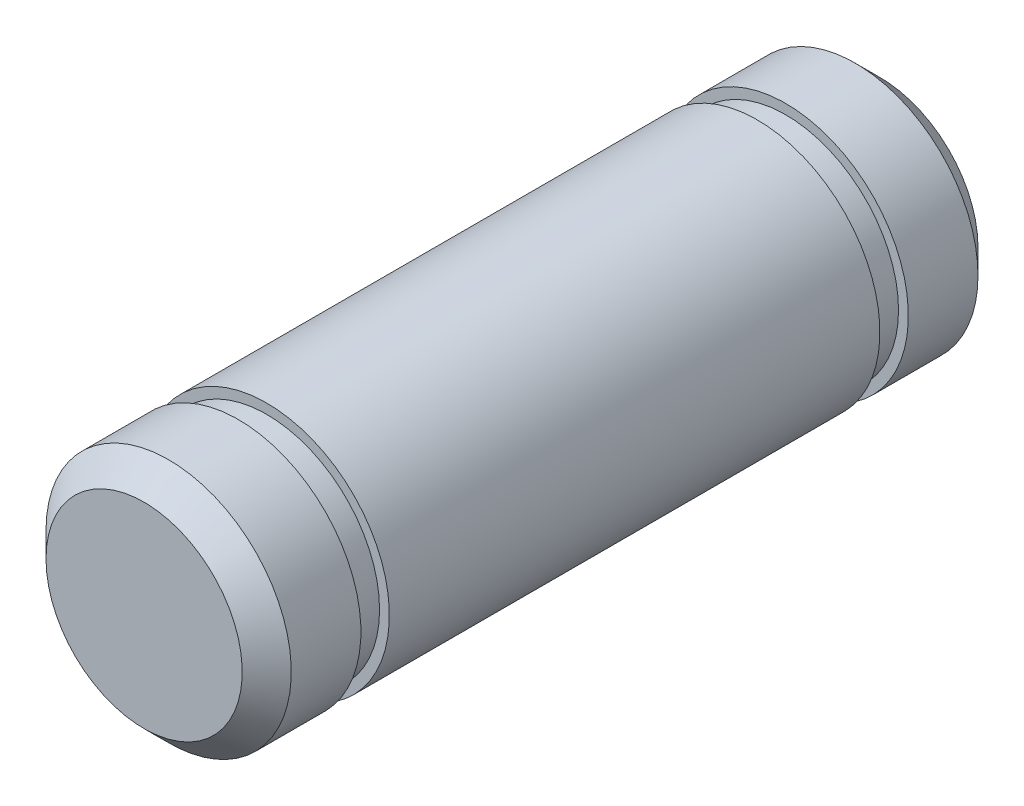
ISO-10303-21;
HEADER;
FILE_DESCRIPTION(('STEP AP214'),'2;1');
FILE_NAME('part.step','',(''),(''),'','','');
FILE_SCHEMA(('AUTOMOTIVE_DESIGN { 1 0 10303 214 1 1 1 1 }'));
ENDSEC;
DATA;
#1=APPLICATION_CONTEXT('core data for automotive mechanical design processes');
#2=APPLICATION_PROTOCOL_DEFINITION('international standard','automotive_design',2000,#1);
#3=PRODUCT_CONTEXT('',#1,'mechanical');
#4=PRODUCT('Part','Part','',(#3));
#5=PRODUCT_RELATED_PRODUCT_CATEGORY('part','',(#4));
#6=PRODUCT_DEFINITION_FORMATION('','',#4);
#7=PRODUCT_DEFINITION_CONTEXT('part definition',#1,'design');
#8=PRODUCT_DEFINITION('design','',#6,#7);
#9=PRODUCT_DEFINITION_SHAPE('','',#8);
#10=(LENGTH_UNIT() NAMED_UNIT(*) SI_UNIT(.MILLI.,.METRE.));
#11=(NAMED_UNIT(*) PLANE_ANGLE_UNIT() SI_UNIT($,.RADIAN.));
#12=(NAMED_UNIT(*) SI_UNIT($,.STERADIAN.) SOLID_ANGLE_UNIT());
#13=UNCERTAINTY_MEASURE_WITH_UNIT(LENGTH_MEASURE(1.E-05),#10,'distance_accuracy_value','');
#14=(GEOMETRIC_REPRESENTATION_CONTEXT(3) GLOBAL_UNCERTAINTY_ASSIGNED_CONTEXT((#13)) GLOBAL_UNIT_ASSIGNED_CONTEXT((#10,
#11,#12)) REPRESENTATION_CONTEXT('',''));
#15=CARTESIAN_POINT('',(0.,0.,0.));
#16=DIRECTION('',(0.,0.,1.));
#17=DIRECTION('',(1.,0.,0.));
#18=AXIS2_PLACEMENT_3D('',#15,#16,#17);
#19=CARTESIAN_POINT('',(0.,0.,76.2));
#20=DIRECTION('',(0.,0.,-1.));
#21=DIRECTION('',(-1.,0.,0.));
#22=AXIS2_PLACEMENT_3D('',#19,#20,#21);
#23=CYLINDRICAL_SURFACE('',#22,3.175);
#24=CARTESIAN_POINT('',(0.,0.,-59.5884));
#25=DIRECTION('',(0.,0.,1.));
#26=DIRECTION('',(1.,0.,0.));
#27=AXIS2_PLACEMENT_3D('',#24,#25,#26);
#28=CIRCLE('',#27,3.175);
#29=CARTESIAN_POINT('',(-3.175,0.,-59.5884));
#30=VERTEX_POINT('',#29);
#31=EDGE_CURVE('E56',#30,#30,#28,.T.);
#32=CARTESIAN_POINT('',(0.,0.,-57.785));
#33=DIRECTION('',(0.,0.,-1.));
#34=DIRECTION('',(-1.,0.,0.));
#35=AXIS2_PLACEMENT_3D('',#32,#33,#34);
#36=CIRCLE('',#35,3.175);
#37=CARTESIAN_POINT('',(-3.175,0.,-57.785));
#38=VERTEX_POINT('',#37);
#39=EDGE_CURVE('E43',#38,#38,#36,.T.);
#40=CARTESIAN_POINT('',(-3.175,0.,-59.5884));
#41=CARTESIAN_POINT('',(-3.175,0.,-59.5696145833333));
#42=CARTESIAN_POINT('',(-3.175,0.,-59.5508291666667));
#43=CARTESIAN_POINT('',(-3.175,0.,-59.5132583333333));
#44=CARTESIAN_POINT('',(-3.175,0.,-59.4944729166667));
#45=CARTESIAN_POINT('',(-3.175,0.,-59.4569020833333));
#46=CARTESIAN_POINT('',(-3.175,0.,-59.4381166666667));
#47=CARTESIAN_POINT('',(-3.175,0.,-59.4005458333333));
#48=CARTESIAN_POINT('',(-3.175,0.,-59.3817604166667));
#49=CARTESIAN_POINT('',(-3.175,0.,-59.3441895833333));
#50=CARTESIAN_POINT('',(-3.175,0.,-59.3254041666667));
#51=CARTESIAN_POINT('',(-3.175,0.,-59.2878333333333));
#52=CARTESIAN_POINT('',(-3.175,0.,-59.2690479166667));
#53=CARTESIAN_POINT('',(-3.175,0.,-59.2314770833333));
#54=CARTESIAN_POINT('',(-3.175,0.,-59.2126916666667));
#55=CARTESIAN_POINT('',(-3.175,0.,-59.1751208333333));
#56=CARTESIAN_POINT('',(-3.175,0.,-59.1563354166667));
#57=CARTESIAN_POINT('',(-3.175,0.,-59.1187645833333));
#58=CARTESIAN_POINT('',(-3.175,0.,-59.0999791666667));
#59=CARTESIAN_POINT('',(-3.175,0.,-59.0624083333333));
#60=CARTESIAN_POINT('',(-3.175,0.,-59.0436229166667));
#61=CARTESIAN_POINT('',(-3.175,0.,-59.0060520833333));
#62=CARTESIAN_POINT('',(-3.175,0.,-58.9872666666667));
#63=CARTESIAN_POINT('',(-3.175,0.,-58.9496958333333));
#64=CARTESIAN_POINT('',(-3.175,0.,-58.9309104166667));
#65=CARTESIAN_POINT('',(-3.175,0.,-58.8933395833333));
#66=CARTESIAN_POINT('',(-3.175,0.,-58.8745541666667));
#67=CARTESIAN_POINT('',(-3.175,0.,-58.8369833333333));
#68=CARTESIAN_POINT('',(-3.175,0.,-58.8181979166667));
#69=CARTESIAN_POINT('',(-3.175,0.,-58.7806270833333));
#70=CARTESIAN_POINT('',(-3.175,0.,-58.7618416666667));
#71=CARTESIAN_POINT('',(-3.175,0.,-58.7242708333333));
#72=CARTESIAN_POINT('',(-3.175,0.,-58.7054854166667));
#73=CARTESIAN_POINT('',(-3.175,0.,-58.6679145833333));
#74=CARTESIAN_POINT('',(-3.175,0.,-58.6491291666667));
#75=CARTESIAN_POINT('',(-3.175,0.,-58.6115583333333));
#76=CARTESIAN_POINT('',(-3.175,0.,-58.5927729166667));
#77=CARTESIAN_POINT('',(-3.175,0.,-58.5552020833333));
#78=CARTESIAN_POINT('',(-3.175,0.,-58.5364166666667));
#79=CARTESIAN_POINT('',(-3.175,0.,-58.4988458333333));
#80=CARTESIAN_POINT('',(-3.175,0.,-58.4800604166667));
#81=CARTESIAN_POINT('',(-3.175,0.,-58.4424895833333));
#82=CARTESIAN_POINT('',(-3.175,0.,-58.4237041666667));
#83=CARTESIAN_POINT('',(-3.175,0.,-58.3861333333333));
#84=CARTESIAN_POINT('',(-3.175,0.,-58.3673479166667));
#85=CARTESIAN_POINT('',(-3.175,0.,-58.3297770833333));
#86=CARTESIAN_POINT('',(-3.175,0.,-58.3109916666667));
#87=CARTESIAN_POINT('',(-3.175,0.,-58.2734208333333));
#88=CARTESIAN_POINT('',(-3.175,0.,-58.2546354166667));
#89=CARTESIAN_POINT('',(-3.175,0.,-58.2170645833333));
#90=CARTESIAN_POINT('',(-3.175,0.,-58.1982791666667));
#91=CARTESIAN_POINT('',(-3.175,0.,-58.1607083333333));
#92=CARTESIAN_POINT('',(-3.175,0.,-58.1419229166667));
#93=CARTESIAN_POINT('',(-3.175,0.,-58.1043520833333));
#94=CARTESIAN_POINT('',(-3.175,0.,-58.0855666666667));
#95=CARTESIAN_POINT('',(-3.175,0.,-58.0479958333333));
#96=CARTESIAN_POINT('',(-3.175,0.,-58.0292104166667));
#97=CARTESIAN_POINT('',(-3.175,0.,-57.9916395833333));
#98=CARTESIAN_POINT('',(-3.175,0.,-57.9728541666667));
#99=CARTESIAN_POINT('',(-3.175,0.,-57.9352833333333));
#100=CARTESIAN_POINT('',(-3.175,0.,-57.9164979166667));
#101=CARTESIAN_POINT('',(-3.175,0.,-57.8789270833333));
#102=CARTESIAN_POINT('',(-3.175,0.,-57.8601416666667));
#103=CARTESIAN_POINT('',(-3.175,0.,-57.8225708333333));
#104=CARTESIAN_POINT('',(-3.175,0.,-57.8037854166667));
#105=CARTESIAN_POINT('',(-3.175,0.,-57.785));
#106=B_SPLINE_CURVE_WITH_KNOTS('',3,(#40,#41,#42,#43,#44,#45,#46,#47,#48,#49,#50,#51,#52,#53,
#54,#55,#56,#57,#58,#59,#60,#61,#62,#63,#64,#65,#66,#67,#68,#69,#70,#71,#72,#73,#74,#75,#76,#77,
#78,#79,#80,#81,#82,#83,#84,#85,#86,#87,#88,#89,#90,#91,#92,#93,#94,#95,#96,#97,#98,#99,#100,
#101,#102,#103,#104,#105),.UNSPECIFIED.,.F.,.F.,(4,2,2,2,2,2,2,2,2,2,2,2,2,2,2,2,2,2,2,2,2,2,2,
2,2,2,2,2,2,2,2,2,4),(0.,0.0563562500000003,0.112712500000001,0.169068750000001,
0.225425000000001,0.281781250000002,0.338137500000002,0.394493750000002,0.450850000000003,
0.507206250000003,0.563562500000003,0.619918750000004,0.676275000000004,0.732631250000004,
0.788987500000005,0.845343750000005,0.901700000000005,0.958056250000006,1.01441250000001,
1.07076875000001,1.12712500000001,1.18348125000001,1.23983750000001,1.29619375000001,
1.35255000000001,1.40890625000001,1.46526250000001,1.52161875000001,1.57797500000001,
1.63433125000001,1.69068750000001,1.74704375000001,1.80340000000001),.UNSPECIFIED.);
#107=EDGE_CURVE('BSEAM35',#30,#38,#106,.T.);
#108=ORIENTED_EDGE('',*,*,#31,.T.);
#109=ORIENTED_EDGE('',*,*,#39,.T.);
#110=ORIENTED_EDGE('',*,*,#107,.T.);
#111=ORIENTED_EDGE('',*,*,#107,.F.);
#112=EDGE_LOOP('',(#108,#110,#109,#111));
#113=FACE_BOUND('',#112,.T.);
#114=ADVANCED_FACE('F35',(#113),#23,.T.);
#115=CARTESIAN_POINT('',(0.,0.,-57.15));
#116=DIRECTION('',(0.,0.,-1.));
#117=DIRECTION('',(-1.,0.,0.));
#118=AXIS2_PLACEMENT_3D('',#115,#116,#117);
#119=PLANE('',#118);
#120=CARTESIAN_POINT('',(0.,0.,-57.15));
#121=DIRECTION('',(0.,0.,-1.));
#122=DIRECTION('',(-1.,0.,0.));
#123=AXIS2_PLACEMENT_3D('',#120,#121,#122);
#124=CIRCLE('',#123,2.54);
#125=CARTESIAN_POINT('',(-2.54,0.,-57.15));
#126=VERTEX_POINT('',#125);
#127=EDGE_CURVE('E10',#126,#126,#124,.F.);
#128=ORIENTED_EDGE('',*,*,#127,.T.);
#129=EDGE_LOOP('',(#128));
#130=FACE_BOUND('',#129,.T.);
#131=ADVANCED_FACE('F124',(#130),#119,.F.);
#132=CARTESIAN_POINT('',(0.,0.,-57.785));
#133=DIRECTION('',(0.,0.,-1.));
#134=DIRECTION('',(-1.,0.,0.));
#135=AXIS2_PLACEMENT_3D('',#132,#133,#134);
#136=CONICAL_SURFACE('',#135,3.175,0.785398163397459);
#137=ORIENTED_EDGE('',*,*,#127,.F.);
#138=EDGE_LOOP('',(#137));
#139=FACE_BOUND('',#138,.T.);
#140=ORIENTED_EDGE('',*,*,#39,.F.);
#141=EDGE_LOOP('',(#140));
#142=FACE_BOUND('',#141,.T.);
#143=ADVANCED_FACE('F38',(#139,#142),#136,.T.);
#144=CARTESIAN_POINT('',(3.175,0.,-59.5884));
#145=DIRECTION('',(0.,0.,1.));
#146=DIRECTION('',(1.,0.,0.));
#147=AXIS2_PLACEMENT_3D('',#144,#145,#146);
#148=PLANE('',#147);
#149=ORIENTED_EDGE('',*,*,#31,.F.);
#150=EDGE_LOOP('',(#149));
#151=FACE_BOUND('',#150,.T.);
#152=CARTESIAN_POINT('',(0.,0.,-59.5884));
#153=DIRECTION('',(0.,0.,1.));
#154=DIRECTION('',(1.,0.,0.));
#155=AXIS2_PLACEMENT_3D('',#152,#153,#154);
#156=CIRCLE('',#155,2.921);
#157=CARTESIAN_POINT('',(2.921,0.,-59.5884));
#158=VERTEX_POINT('',#157);
#159=EDGE_CURVE('E72',#158,#158,#156,.T.);
#160=ORIENTED_EDGE('',*,*,#159,.T.);
#161=EDGE_LOOP('',(#160));
#162=FACE_BOUND('',#161,.T.);
#163=ADVANCED_FACE('F132',(#151,#162),#148,.F.);
#164=CARTESIAN_POINT('',(0.,0.,-57.785));
#165=DIRECTION('',(0.,0.,1.));
#166=DIRECTION('',(1.,0.,0.));
#167=AXIS2_PLACEMENT_3D('',#164,#165,#166);
#168=CYLINDRICAL_SURFACE('',#167,2.921);
#169=ORIENTED_EDGE('',*,*,#159,.F.);
#170=EDGE_LOOP('',(#169));
#171=FACE_BOUND('',#170,.T.);
#172=CARTESIAN_POINT('',(0.,0.,-60.325));
#173=DIRECTION('',(0.,0.,1.));
#174=DIRECTION('',(1.,0.,0.));
#175=AXIS2_PLACEMENT_3D('',#172,#173,#174);
#176=CIRCLE('',#175,2.921);
#177=CARTESIAN_POINT('',(2.921,0.,-60.325));
#178=VERTEX_POINT('',#177);
#179=EDGE_CURVE('E75',#178,#178,#176,.T.);
#180=ORIENTED_EDGE('',*,*,#179,.T.);
#181=EDGE_LOOP('',(#180));
#182=FACE_BOUND('',#181,.T.);
#183=ADVANCED_FACE('F135',(#171,#182),#168,.T.);
#184=CARTESIAN_POINT('',(3.175,0.,-60.325));
#185=DIRECTION('',(0.,0.,-1.));
#186=DIRECTION('',(-1.,0.,0.));
#187=AXIS2_PLACEMENT_3D('',#184,#185,#186);
#188=PLANE('',#187);
#189=ORIENTED_EDGE('',*,*,#179,.F.);
#190=EDGE_LOOP('',(#189));
#191=FACE_BOUND('',#190,.T.);
#192=CARTESIAN_POINT('',(0.,0.,-60.325));
#193=DIRECTION('',(0.,0.,1.));
#194=DIRECTION('',(1.,0.,0.));
#195=AXIS2_PLACEMENT_3D('',#192,#193,#194);
#196=CIRCLE('',#195,3.175);
#197=CARTESIAN_POINT('',(-3.175,0.,-60.325));
#198=VERTEX_POINT('',#197);
#199=EDGE_CURVE('E60',#198,#198,#196,.T.);
#200=ORIENTED_EDGE('',*,*,#199,.T.);
#201=EDGE_LOOP('',(#200));
#202=FACE_BOUND('',#201,.T.);
#203=ADVANCED_FACE('F81',(#191,#202),#188,.F.);
#204=CARTESIAN_POINT('',(0.,0.,-73.025));
#205=DIRECTION('',(0.,0.,1.));
#206=DIRECTION('',(1.,0.,0.));
#207=AXIS2_PLACEMENT_3D('',#204,#205,#206);
#208=CIRCLE('',#207,3.175);
#209=CARTESIAN_POINT('',(-3.175,0.,-73.025));
#210=VERTEX_POINT('',#209);
#211=EDGE_CURVE('E57',#210,#210,#208,.T.);
#212=CARTESIAN_POINT('',(-3.175,0.,-60.325));
#213=CARTESIAN_POINT('',(-3.175,0.,-60.4572916666667));
#214=CARTESIAN_POINT('',(-3.175,0.,-60.5895833333334));
#215=CARTESIAN_POINT('',(-3.175,0.,-60.8541666666667));
#216=CARTESIAN_POINT('',(-3.175,0.,-60.9864583333334));
#217=CARTESIAN_POINT('',(-3.175,0.,-61.2510416666667));
#218=CARTESIAN_POINT('',(-3.175,0.,-61.3833333333334));
#219=CARTESIAN_POINT('',(-3.175,0.,-61.6479166666667));
#220=CARTESIAN_POINT('',(-3.175,0.,-61.7802083333334));
#221=CARTESIAN_POINT('',(-3.175,0.,-62.0447916666667));
#222=CARTESIAN_POINT('',(-3.175,0.,-62.1770833333334));
#223=CARTESIAN_POINT('',(-3.175,0.,-62.4416666666667));
#224=CARTESIAN_POINT('',(-3.175,0.,-62.5739583333334));
#225=CARTESIAN_POINT('',(-3.175,0.,-62.8385416666667));
#226=CARTESIAN_POINT('',(-3.175,0.,-62.9708333333334));
#227=CARTESIAN_POINT('',(-3.175,0.,-63.2354166666667));
#228=CARTESIAN_POINT('',(-3.175,0.,-63.3677083333334));
#229=CARTESIAN_POINT('',(-3.175,0.,-63.6322916666667));
#230=CARTESIAN_POINT('',(-3.175,0.,-63.7645833333334));
#231=CARTESIAN_POINT('',(-3.175,0.,-64.0291666666667));
#232=CARTESIAN_POINT('',(-3.175,0.,-64.1614583333334));
#233=CARTESIAN_POINT('',(-3.175,0.,-64.4260416666667));
#234=CARTESIAN_POINT('',(-3.175,0.,-64.5583333333334));
#235=CARTESIAN_POINT('',(-3.175,0.,-64.8229166666667));
#236=CARTESIAN_POINT('',(-3.175,0.,-64.9552083333334));
#237=CARTESIAN_POINT('',(-3.175,0.,-65.2197916666667));
#238=CARTESIAN_POINT('',(-3.175,0.,-65.3520833333334));
#239=CARTESIAN_POINT('',(-3.175,0.,-65.6166666666667));
#240=CARTESIAN_POINT('',(-3.175,0.,-65.7489583333334));
#241=CARTESIAN_POINT('',(-3.175,0.,-66.0135416666667));
#242=CARTESIAN_POINT('',(-3.175,0.,-66.1458333333334));
#243=CARTESIAN_POINT('',(-3.175,0.,-66.4104166666667));
#244=CARTESIAN_POINT('',(-3.175,0.,-66.5427083333334));
#245=CARTESIAN_POINT('',(-3.175,0.,-66.8072916666667));
#246=CARTESIAN_POINT('',(-3.175,0.,-66.9395833333334));
#247=CARTESIAN_POINT('',(-3.175,0.,-67.2041666666667));
#248=CARTESIAN_POINT('',(-3.175,0.,-67.3364583333334));
#249=CARTESIAN_POINT('',(-3.175,0.,-67.6010416666667));
#250=CARTESIAN_POINT('',(-3.175,0.,-67.7333333333334));
#251=CARTESIAN_POINT('',(-3.175,0.,-67.9979166666667));
#252=CARTESIAN_POINT('',(-3.175,0.,-68.1302083333334));
#253=CARTESIAN_POINT('',(-3.175,0.,-68.3947916666667));
#254=CARTESIAN_POINT('',(-3.175,0.,-68.5270833333334));
#255=CARTESIAN_POINT('',(-3.175,0.,-68.7916666666667));
#256=CARTESIAN_POINT('',(-3.175,0.,-68.9239583333334));
#257=CARTESIAN_POINT('',(-3.175,0.,-69.1885416666667));
#258=CARTESIAN_POINT('',(-3.175,0.,-69.3208333333334));
#259=CARTESIAN_POINT('',(-3.175,0.,-69.5854166666667));
#260=CARTESIAN_POINT('',(-3.175,0.,-69.7177083333334));
#261=CARTESIAN_POINT('',(-3.175,0.,-69.9822916666667));
#262=CARTESIAN_POINT('',(-3.175,0.,-70.1145833333334));
#263=CARTESIAN_POINT('',(-3.175,0.,-70.3791666666667));
#264=CARTESIAN_POINT('',(-3.175,0.,-70.5114583333334));
#265=CARTESIAN_POINT('',(-3.175,0.,-70.7760416666667));
#266=CARTESIAN_POINT('',(-3.175,0.,-70.9083333333333));
#267=CARTESIAN_POINT('',(-3.175,0.,-71.1729166666667));
#268=CARTESIAN_POINT('',(-3.175,0.,-71.3052083333334));
#269=CARTESIAN_POINT('',(-3.175,0.,-71.5697916666667));
#270=CARTESIAN_POINT('',(-3.175,0.,-71.7020833333334));
#271=CARTESIAN_POINT('',(-3.175,0.,-71.9666666666667));
#272=CARTESIAN_POINT('',(-3.175,0.,-72.0989583333334));
#273=CARTESIAN_POINT('',(-3.175,0.,-72.3635416666667));
#274=CARTESIAN_POINT('',(-3.175,0.,-72.4958333333334));
#275=CARTESIAN_POINT('',(-3.175,0.,-72.7604166666667));
#276=CARTESIAN_POINT('',(-3.175,0.,-72.8927083333334));
#277=CARTESIAN_POINT('',(-3.175,0.,-73.025));
#278=B_SPLINE_CURVE_WITH_KNOTS('',3,(#212,#213,#214,#215,#216,#217,#218,#219,#220,#221,#222,
#223,#224,#225,#226,#227,#228,#229,#230,#231,#232,#233,#234,#235,#236,#237,#238,#239,#240,#241,
#242,#243,#244,#245,#246,#247,#248,#249,#250,#251,#252,#253,#254,#255,#256,#257,#258,#259,#260,
#261,#262,#263,#264,#265,#266,#267,#268,#269,#270,#271,#272,#273,#274,#275,#276,#277),
.UNSPECIFIED.,.F.,.F.,(4,2,2,2,2,2,2,2,2,2,2,2,2,2,2,2,2,2,2,2,2,2,2,2,2,2,2,2,2,2,2,2,4),(0.,
0.396874999999991,0.79375000000001,1.190625,1.58749999999999,1.98437500000001,2.38125,
2.77812499999999,3.17499999999998,3.571875,3.96874999999999,4.36562499999998,4.7625,
5.15937499999999,5.55624999999998,5.953125,6.34999999999999,6.74687499999999,7.14375,7.540625,
7.93749999999999,8.334375,8.73125,9.12812499999999,9.52500000000001,9.921875,10.31875,10.715625,
11.1125,11.509375,11.90625,12.303125,12.7),.UNSPECIFIED.);
#279=EDGE_CURVE('BSEAM83',#198,#210,#278,.T.);
#280=ORIENTED_EDGE('',*,*,#199,.F.);
#281=ORIENTED_EDGE('',*,*,#211,.T.);
#282=ORIENTED_EDGE('',*,*,#279,.T.);
#283=ORIENTED_EDGE('',*,*,#279,.F.);
#284=EDGE_LOOP('',(#280,#282,#281,#283));
#285=FACE_BOUND('',#284,.T.);
#286=ADVANCED_FACE('F83',(#285),#23,.T.);
#287=CARTESIAN_POINT('',(3.175,0.,-73.025));
#288=DIRECTION('',(0.,0.,1.));
#289=DIRECTION('',(1.,0.,0.));
#290=AXIS2_PLACEMENT_3D('',#287,#288,#289);
#291=PLANE('',#290);
#292=ORIENTED_EDGE('',*,*,#211,.F.);
#293=EDGE_LOOP('',(#292));
#294=FACE_BOUND('',#293,.T.);
#295=CARTESIAN_POINT('',(0.,0.,-73.025));
#296=DIRECTION('',(0.,0.,1.));
#297=DIRECTION('',(1.,0.,0.));
#298=AXIS2_PLACEMENT_3D('',#295,#296,#297);
#299=CIRCLE('',#298,2.921);
#300=CARTESIAN_POINT('',(2.921,0.,-73.025));
#301=VERTEX_POINT('',#300);
#302=EDGE_CURVE('E61',#301,#301,#299,.T.);
#303=ORIENTED_EDGE('',*,*,#302,.T.);
#304=EDGE_LOOP('',(#303));
#305=FACE_BOUND('',#304,.T.);
#306=ADVANCED_FACE('F86',(#294,#305),#291,.F.);
#307=CARTESIAN_POINT('',(0.,0.,-57.785));
#308=DIRECTION('',(0.,0.,1.));
#309=DIRECTION('',(1.,0.,0.));
#310=AXIS2_PLACEMENT_3D('',#307,#308,#309);
#311=CYLINDRICAL_SURFACE('',#310,2.921);
#312=ORIENTED_EDGE('',*,*,#302,.F.);
#313=EDGE_LOOP('',(#312));
#314=FACE_BOUND('',#313,.T.);
#315=CARTESIAN_POINT('',(0.,0.,-73.7616));
#316=DIRECTION('',(0.,0.,1.));
#317=DIRECTION('',(1.,0.,0.));
#318=AXIS2_PLACEMENT_3D('',#315,#316,#317);
#319=CIRCLE('',#318,2.921);
#320=CARTESIAN_POINT('',(2.921,0.,-73.7616));
#321=VERTEX_POINT('',#320);
#322=EDGE_CURVE('E64',#321,#321,#319,.T.);
#323=ORIENTED_EDGE('',*,*,#322,.T.);
#324=EDGE_LOOP('',(#323));
#325=FACE_BOUND('',#324,.T.);
#326=ADVANCED_FACE('F93',(#314,#325),#311,.T.);
#327=CARTESIAN_POINT('',(3.175,0.,-73.7616));
#328=DIRECTION('',(0.,0.,-1.));
#329=DIRECTION('',(-1.,0.,0.));
#330=AXIS2_PLACEMENT_3D('',#327,#328,#329);
#331=PLANE('',#330);
#332=ORIENTED_EDGE('',*,*,#322,.F.);
#333=EDGE_LOOP('',(#332));
#334=FACE_BOUND('',#333,.T.);
#335=CARTESIAN_POINT('',(0.,0.,-73.7616));
#336=DIRECTION('',(0.,0.,1.));
#337=DIRECTION('',(1.,0.,0.));
#338=AXIS2_PLACEMENT_3D('',#335,#336,#337);
#339=CIRCLE('',#338,3.175);
#340=CARTESIAN_POINT('',(-3.175,0.,-73.7616));
#341=VERTEX_POINT('',#340);
#342=EDGE_CURVE('E67',#341,#341,#339,.T.);
#343=ORIENTED_EDGE('',*,*,#342,.T.);
#344=EDGE_LOOP('',(#343));
#345=FACE_BOUND('',#344,.T.);
#346=ADVANCED_FACE('F99',(#334,#345),#331,.F.);
#347=CARTESIAN_POINT('',(0.,0.,-76.2));
#348=DIRECTION('',(0.,0.,1.));
#349=DIRECTION('',(1.,0.,0.));
#350=AXIS2_PLACEMENT_3D('',#347,#348,#349);
#351=PLANE('',#350);
#352=CARTESIAN_POINT('',(0.,0.,-76.2));
#353=DIRECTION('',(0.,0.,1.));
#354=DIRECTION('',(1.,0.,0.));
#355=AXIS2_PLACEMENT_3D('',#352,#353,#354);
#356=CIRCLE('',#355,2.53999999999988);
#357=CARTESIAN_POINT('',(2.53999999999988,0.,-76.2));
#358=VERTEX_POINT('',#357);
#359=EDGE_CURVE('E47',#358,#358,#356,.F.);
#360=ORIENTED_EDGE('',*,*,#359,.T.);
#361=EDGE_LOOP('',(#360));
#362=FACE_BOUND('',#361,.T.);
#363=ADVANCED_FACE('F105',(#362),#351,.F.);
#364=CARTESIAN_POINT('',(0.,0.,-75.5649999999999));
#365=DIRECTION('',(0.,0.,1.));
#366=DIRECTION('',(1.,0.,0.));
#367=AXIS2_PLACEMENT_3D('',#364,#365,#366);
#368=CONICAL_SURFACE('',#367,3.175,0.78539816339744);
#369=ORIENTED_EDGE('',*,*,#359,.F.);
#370=EDGE_LOOP('',(#369));
#371=FACE_BOUND('',#370,.T.);
#372=CARTESIAN_POINT('',(0.,0.,-75.5649999999999));
#373=DIRECTION('',(0.,0.,1.));
#374=DIRECTION('',(1.,0.,0.));
#375=AXIS2_PLACEMENT_3D('',#372,#373,#374);
#376=CIRCLE('',#375,3.175);
#377=CARTESIAN_POINT('',(-3.175,0.,-75.5649999999999));
#378=VERTEX_POINT('',#377);
#379=EDGE_CURVE('E51',#378,#378,#376,.T.);
#380=ORIENTED_EDGE('',*,*,#379,.F.);
#381=EDGE_LOOP('',(#380));
#382=FACE_BOUND('',#381,.T.);
#383=ADVANCED_FACE('F111',(#371,#382),#368,.T.);
#384=CARTESIAN_POINT('',(-3.175,0.,-73.7616));
#385=CARTESIAN_POINT('',(-3.175,0.,-73.7803854166667));
#386=CARTESIAN_POINT('',(-3.175,0.,-73.7991708333333));
#387=CARTESIAN_POINT('',(-3.175,0.,-73.8367416666667));
#388=CARTESIAN_POINT('',(-3.175,0.,-73.8555270833333));
#389=CARTESIAN_POINT('',(-3.175,0.,-73.8930979166667));
#390=CARTESIAN_POINT('',(-3.175,0.,-73.9118833333333));
#391=CARTESIAN_POINT('',(-3.175,0.,-73.9494541666667));
#392=CARTESIAN_POINT('',(-3.175,0.,-73.9682395833333));
#393=CARTESIAN_POINT('',(-3.175,0.,-74.0058104166666));
#394=CARTESIAN_POINT('',(-3.175,0.,-74.0245958333333));
#395=CARTESIAN_POINT('',(-3.175,0.,-74.0621666666666));
#396=CARTESIAN_POINT('',(-3.175,0.,-74.0809520833333));
#397=CARTESIAN_POINT('',(-3.175,0.,-74.1185229166666));
#398=CARTESIAN_POINT('',(-3.175,0.,-74.1373083333333));
#399=CARTESIAN_POINT('',(-3.175,0.,-74.1748791666666));
#400=CARTESIAN_POINT('',(-3.175,0.,-74.1936645833333));
#401=CARTESIAN_POINT('',(-3.175,0.,-74.2312354166666));
#402=CARTESIAN_POINT('',(-3.175,0.,-74.2500208333333));
#403=CARTESIAN_POINT('',(-3.175,0.,-74.2875916666666));
#404=CARTESIAN_POINT('',(-3.175,0.,-74.3063770833333));
#405=CARTESIAN_POINT('',(-3.175,0.,-74.3439479166666));
#406=CARTESIAN_POINT('',(-3.175,0.,-74.3627333333333));
#407=CARTESIAN_POINT('',(-3.175,0.,-74.4003041666666));
#408=CARTESIAN_POINT('',(-3.175,0.,-74.4190895833333));
#409=CARTESIAN_POINT('',(-3.175,0.,-74.4566604166666));
#410=CARTESIAN_POINT('',(-3.175,0.,-74.4754458333333));
#411=CARTESIAN_POINT('',(-3.175,0.,-74.5130166666666));
#412=CARTESIAN_POINT('',(-3.175,0.,-74.5318020833333));
#413=CARTESIAN_POINT('',(-3.175,0.,-74.5693729166666));
#414=CARTESIAN_POINT('',(-3.175,0.,-74.5881583333333));
#415=CARTESIAN_POINT('',(-3.175,0.,-74.6257291666666));
#416=CARTESIAN_POINT('',(-3.175,0.,-74.6445145833333));
#417=CARTESIAN_POINT('',(-3.175,0.,-74.6820854166666));
#418=CARTESIAN_POINT('',(-3.175,0.,-74.7008708333333));
#419=CARTESIAN_POINT('',(-3.175,0.,-74.7384416666666));
#420=CARTESIAN_POINT('',(-3.175,0.,-74.7572270833333));
#421=CARTESIAN_POINT('',(-3.175,0.,-74.7947979166666));
#422=CARTESIAN_POINT('',(-3.175,0.,-74.8135833333333));
#423=CARTESIAN_POINT('',(-3.175,0.,-74.8511541666666));
#424=CARTESIAN_POINT('',(-3.175,0.,-74.8699395833333));
#425=CARTESIAN_POINT('',(-3.175,0.,-74.9075104166666));
#426=CARTESIAN_POINT('',(-3.175,0.,-74.9262958333333));
#427=CARTESIAN_POINT('',(-3.175,0.,-74.9638666666666));
#428=CARTESIAN_POINT('',(-3.175,0.,-74.9826520833332));
#429=CARTESIAN_POINT('',(-3.175,0.,-75.0202229166666));
#430=CARTESIAN_POINT('',(-3.175,0.,-75.0390083333333));
#431=CARTESIAN_POINT('',(-3.175,0.,-75.0765791666666));
#432=CARTESIAN_POINT('',(-3.175,0.,-75.0953645833333));
#433=CARTESIAN_POINT('',(-3.175,0.,-75.1329354166666));
#434=CARTESIAN_POINT('',(-3.175,0.,-75.1517208333333));
#435=CARTESIAN_POINT('',(-3.175,0.,-75.1892916666666));
#436=CARTESIAN_POINT('',(-3.175,0.,-75.2080770833333));
#437=CARTESIAN_POINT('',(-3.175,0.,-75.2456479166666));
#438=CARTESIAN_POINT('',(-3.175,0.,-75.2644333333333));
#439=CARTESIAN_POINT('',(-3.175,0.,-75.3020041666666));
#440=CARTESIAN_POINT('',(-3.175,0.,-75.3207895833332));
#441=CARTESIAN_POINT('',(-3.175,0.,-75.3583604166666));
#442=CARTESIAN_POINT('',(-3.175,0.,-75.3771458333332));
#443=CARTESIAN_POINT('',(-3.175,0.,-75.4147166666666));
#444=CARTESIAN_POINT('',(-3.175,0.,-75.4335020833332));
#445=CARTESIAN_POINT('',(-3.175,0.,-75.4710729166666));
#446=CARTESIAN_POINT('',(-3.175,0.,-75.4898583333332));
#447=CARTESIAN_POINT('',(-3.175,0.,-75.5274291666666));
#448=CARTESIAN_POINT('',(-3.175,0.,-75.5462145833332));
#449=CARTESIAN_POINT('',(-3.175,0.,-75.5649999999999));
#450=B_SPLINE_CURVE_WITH_KNOTS('',3,(#384,#385,#386,#387,#388,#389,#390,#391,#392,#393,#394,
#395,#396,#397,#398,#399,#400,#401,#402,#403,#404,#405,#406,#407,#408,#409,#410,#411,#412,#413,
#414,#415,#416,#417,#418,#419,#420,#421,#422,#423,#424,#425,#426,#427,#428,#429,#430,#431,#432,
#433,#434,#435,#436,#437,#438,#439,#440,#441,#442,#443,#444,#445,#446,#447,#448,#449),
.UNSPECIFIED.,.F.,.F.,(4,2,2,2,2,2,2,2,2,2,2,2,2,2,2,2,2,2,2,2,2,2,2,2,2,2,2,2,2,2,2,2,4),(0.,
0.0563562500000003,0.112712500000001,0.169068750000001,0.225425000000001,0.281781249999974,
0.338137499999974,0.394493749999975,0.450849999999975,0.507206249999975,0.563562499999976,
0.619918749999976,0.676274999999948,0.732631249999949,0.788987499999949,0.845343749999949,
0.90169999999995,0.95805624999995,1.01441249999995,1.07076874999995,1.12712499999995,
1.18348124999992,1.23983749999992,1.29619374999992,1.35254999999992,1.40890624999992,
1.46526249999993,1.52161874999993,1.5779749999999,1.6343312499999,1.6906874999999,
1.7470437499999,1.8033999999999),.UNSPECIFIED.);
#451=EDGE_CURVE('BSEAM88',#341,#378,#450,.T.);
#452=ORIENTED_EDGE('',*,*,#342,.F.);
#453=ORIENTED_EDGE('',*,*,#379,.T.);
#454=ORIENTED_EDGE('',*,*,#451,.T.);
#455=ORIENTED_EDGE('',*,*,#451,.F.);
#456=EDGE_LOOP('',(#452,#454,#453,#455));
#457=FACE_BOUND('',#456,.T.);
#458=ADVANCED_FACE('F88',(#457),#23,.T.);
#459=CLOSED_SHELL('',(#114,#131,#143,#163,#183,#203,#286,#306,#326,#346,#363,#383,#458));
#460=MANIFOLD_SOLID_BREP('B2',#459);
#461=ADVANCED_BREP_SHAPE_REPRESENTATION('',(#18,#460),#14);
#462=SHAPE_DEFINITION_REPRESENTATION(#9,#461);
ENDSEC;
END-ISO-10303-21;
